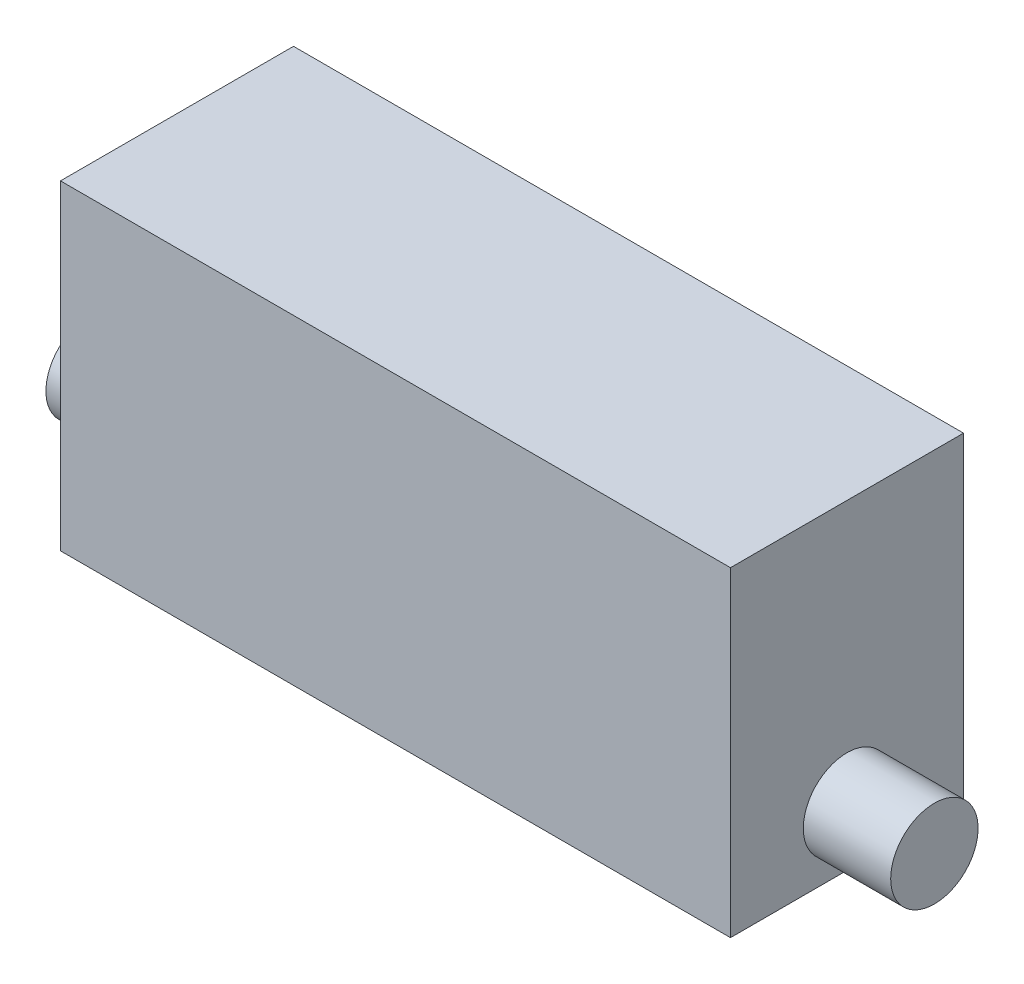
ISO-10303-21;
HEADER;
FILE_DESCRIPTION(('STEP AP214'),'2;1');
FILE_NAME('part.step','',(''),(''),'','','');
FILE_SCHEMA(('AUTOMOTIVE_DESIGN { 1 0 10303 214 1 1 1 1 }'));
ENDSEC;
DATA;
#1=APPLICATION_CONTEXT('core data for automotive mechanical design processes');
#2=APPLICATION_PROTOCOL_DEFINITION('international standard','automotive_design',2000,#1);
#3=PRODUCT_CONTEXT('',#1,'mechanical');
#4=PRODUCT('Part','Part','',(#3));
#5=PRODUCT_RELATED_PRODUCT_CATEGORY('part','',(#4));
#6=PRODUCT_DEFINITION_FORMATION('','',#4);
#7=PRODUCT_DEFINITION_CONTEXT('part definition',#1,'design');
#8=PRODUCT_DEFINITION('design','',#6,#7);
#9=PRODUCT_DEFINITION_SHAPE('','',#8);
#10=(LENGTH_UNIT() NAMED_UNIT(*) SI_UNIT(.MILLI.,.METRE.));
#11=(NAMED_UNIT(*) PLANE_ANGLE_UNIT() SI_UNIT($,.RADIAN.));
#12=(NAMED_UNIT(*) SI_UNIT($,.STERADIAN.) SOLID_ANGLE_UNIT());
#13=UNCERTAINTY_MEASURE_WITH_UNIT(LENGTH_MEASURE(1.E-05),#10,'distance_accuracy_value','');
#14=(GEOMETRIC_REPRESENTATION_CONTEXT(3) GLOBAL_UNCERTAINTY_ASSIGNED_CONTEXT((#13)) GLOBAL_UNIT_ASSIGNED_CONTEXT((#10,
#11,#12)) REPRESENTATION_CONTEXT('',''));
#15=CARTESIAN_POINT('',(0.,0.,0.));
#16=DIRECTION('',(0.,0.,1.));
#17=DIRECTION('',(1.,0.,0.));
#18=AXIS2_PLACEMENT_3D('',#15,#16,#17);
#19=CARTESIAN_POINT('',(0.,69.85,0.));
#20=DIRECTION('',(1.,0.,0.));
#21=DIRECTION('',(0.,0.,-1.));
#22=AXIS2_PLACEMENT_3D('',#19,#20,#21);
#23=PLANE('',#22);
#24=CARTESIAN_POINT('',(0.,12.7,-25.4));
#25=DIRECTION('',(1.,0.,0.));
#26=DIRECTION('',(0.,0.,-1.));
#27=AXIS2_PLACEMENT_3D('',#24,#25,#26);
#28=CIRCLE('',#27,9.525);
#29=CARTESIAN_POINT('',(0.,12.7,-34.925));
#30=VERTEX_POINT('',#29);
#31=EDGE_CURVE('E11',#30,#30,#28,.F.);
#32=ORIENTED_EDGE('',*,*,#31,.F.);
#33=EDGE_LOOP('',(#32));
#34=FACE_BOUND('',#33,.T.);
#35=DIRECTION('',(0.,0.,1.));
#36=VECTOR('',#35,1.);
#37=CARTESIAN_POINT('',(0.,0.,0.));
#38=LINE('',#37,#36);
#39=CARTESIAN_POINT('',(0.,0.,-50.8));
#40=VERTEX_POINT('',#39);
#41=CARTESIAN_POINT('',(0.,0.,0.));
#42=VERTEX_POINT('',#41);
#43=EDGE_CURVE('E100',#40,#42,#38,.T.);
#44=ORIENTED_EDGE('',*,*,#43,.T.);
#45=DIRECTION('',(0.,-1.,0.));
#46=VECTOR('',#45,1.);
#47=CARTESIAN_POINT('',(0.,69.85,0.));
#48=LINE('',#47,#46);
#49=CARTESIAN_POINT('',(0.,69.85,0.));
#50=VERTEX_POINT('',#49);
#51=EDGE_CURVE('E91',#50,#42,#48,.T.);
#52=ORIENTED_EDGE('',*,*,#51,.F.);
#53=DIRECTION('',(0.,0.,1.));
#54=VECTOR('',#53,1.);
#55=CARTESIAN_POINT('',(0.,69.85,0.));
#56=LINE('',#55,#54);
#57=CARTESIAN_POINT('',(0.,69.85,-50.8));
#58=VERTEX_POINT('',#57);
#59=EDGE_CURVE('E85',#58,#50,#56,.T.);
#60=ORIENTED_EDGE('',*,*,#59,.F.);
#61=DIRECTION('',(0.,-1.,0.));
#62=VECTOR('',#61,1.);
#63=CARTESIAN_POINT('',(0.,69.85,-50.8));
#64=LINE('',#63,#62);
#65=EDGE_CURVE('E96',#58,#40,#64,.T.);
#66=ORIENTED_EDGE('',*,*,#65,.T.);
#67=EDGE_LOOP('',(#44,#52,#60,#66));
#68=FACE_BOUND('',#67,.T.);
#69=ADVANCED_FACE('F33',(#34,#68),#23,.F.);
#70=CARTESIAN_POINT('',(0.,69.85,0.));
#71=DIRECTION('',(0.,0.,-1.));
#72=DIRECTION('',(-1.,0.,0.));
#73=AXIS2_PLACEMENT_3D('',#70,#71,#72);
#74=PLANE('',#73);
#75=DIRECTION('',(1.,0.,0.));
#76=VECTOR('',#75,1.);
#77=CARTESIAN_POINT('',(0.,0.,0.));
#78=LINE('',#77,#76);
#79=CARTESIAN_POINT('',(146.05,0.,0.));
#80=VERTEX_POINT('',#79);
#81=EDGE_CURVE('E90',#42,#80,#78,.T.);
#82=ORIENTED_EDGE('',*,*,#81,.T.);
#83=DIRECTION('',(0.,-1.,0.));
#84=VECTOR('',#83,1.);
#85=CARTESIAN_POINT('',(146.05,69.85,0.));
#86=LINE('',#85,#84);
#87=CARTESIAN_POINT('',(146.05,69.85,0.));
#88=VERTEX_POINT('',#87);
#89=EDGE_CURVE('E88',#88,#80,#86,.T.);
#90=ORIENTED_EDGE('',*,*,#89,.F.);
#91=DIRECTION('',(1.,0.,0.));
#92=VECTOR('',#91,1.);
#93=CARTESIAN_POINT('',(0.,69.85,0.));
#94=LINE('',#93,#92);
#95=EDGE_CURVE('E80',#50,#88,#94,.T.);
#96=ORIENTED_EDGE('',*,*,#95,.F.);
#97=ORIENTED_EDGE('',*,*,#51,.T.);
#98=EDGE_LOOP('',(#82,#90,#96,#97));
#99=FACE_BOUND('',#98,.T.);
#100=ADVANCED_FACE('F89',(#99),#74,.F.);
#101=CARTESIAN_POINT('',(146.05,69.85,0.));
#102=DIRECTION('',(-1.,0.,0.));
#103=DIRECTION('',(0.,0.,1.));
#104=AXIS2_PLACEMENT_3D('',#101,#102,#103);
#105=PLANE('',#104);
#106=CARTESIAN_POINT('',(146.05,12.7,-25.4));
#107=DIRECTION('',(-1.,0.,0.));
#108=DIRECTION('',(0.,0.,1.));
#109=AXIS2_PLACEMENT_3D('',#106,#107,#108);
#110=CIRCLE('',#109,9.525);
#111=CARTESIAN_POINT('',(146.05,12.7,-15.875));
#112=VERTEX_POINT('',#111);
#113=EDGE_CURVE('E41',#112,#112,#110,.F.);
#114=ORIENTED_EDGE('',*,*,#113,.F.);
#115=EDGE_LOOP('',(#114));
#116=FACE_BOUND('',#115,.T.);
#117=DIRECTION('',(0.,0.,-1.));
#118=VECTOR('',#117,1.);
#119=CARTESIAN_POINT('',(146.05,0.,0.));
#120=LINE('',#119,#118);
#121=CARTESIAN_POINT('',(146.05,0.,-50.8));
#122=VERTEX_POINT('',#121);
#123=EDGE_CURVE('E66',#80,#122,#120,.T.);
#124=ORIENTED_EDGE('',*,*,#123,.T.);
#125=DIRECTION('',(0.,-1.,0.));
#126=VECTOR('',#125,1.);
#127=CARTESIAN_POINT('',(146.05,69.85,-50.8));
#128=LINE('',#127,#126);
#129=CARTESIAN_POINT('',(146.05,69.85,-50.8));
#130=VERTEX_POINT('',#129);
#131=EDGE_CURVE('E92',#130,#122,#128,.T.);
#132=ORIENTED_EDGE('',*,*,#131,.F.);
#133=DIRECTION('',(0.,0.,-1.));
#134=VECTOR('',#133,1.);
#135=CARTESIAN_POINT('',(146.05,69.85,0.));
#136=LINE('',#135,#134);
#137=EDGE_CURVE('E83',#88,#130,#136,.T.);
#138=ORIENTED_EDGE('',*,*,#137,.F.);
#139=ORIENTED_EDGE('',*,*,#89,.T.);
#140=EDGE_LOOP('',(#124,#132,#138,#139));
#141=FACE_BOUND('',#140,.T.);
#142=ADVANCED_FACE('F94',(#116,#141),#105,.F.);
#143=CARTESIAN_POINT('',(0.,69.85,-50.8));
#144=DIRECTION('',(0.,0.,1.));
#145=DIRECTION('',(1.,0.,0.));
#146=AXIS2_PLACEMENT_3D('',#143,#144,#145);
#147=PLANE('',#146);
#148=DIRECTION('',(-1.,0.,0.));
#149=VECTOR('',#148,1.);
#150=CARTESIAN_POINT('',(0.,0.,-50.8));
#151=LINE('',#150,#149);
#152=EDGE_CURVE('E72',#122,#40,#151,.T.);
#153=ORIENTED_EDGE('',*,*,#152,.T.);
#154=ORIENTED_EDGE('',*,*,#65,.F.);
#155=DIRECTION('',(-1.,0.,0.));
#156=VECTOR('',#155,1.);
#157=CARTESIAN_POINT('',(0.,69.85,-50.8));
#158=LINE('',#157,#156);
#159=EDGE_CURVE('E49',#130,#58,#158,.T.);
#160=ORIENTED_EDGE('',*,*,#159,.F.);
#161=ORIENTED_EDGE('',*,*,#131,.T.);
#162=EDGE_LOOP('',(#153,#154,#160,#161));
#163=FACE_BOUND('',#162,.T.);
#164=ADVANCED_FACE('F115',(#163),#147,.F.);
#165=CARTESIAN_POINT('',(0.,69.85,0.));
#166=DIRECTION('',(0.,-1.,0.));
#167=DIRECTION('',(0.,0.,-1.));
#168=AXIS2_PLACEMENT_3D('',#165,#166,#167);
#169=PLANE('',#168);
#170=ORIENTED_EDGE('',*,*,#59,.T.);
#171=ORIENTED_EDGE('',*,*,#95,.T.);
#172=ORIENTED_EDGE('',*,*,#137,.T.);
#173=ORIENTED_EDGE('',*,*,#159,.T.);
#174=EDGE_LOOP('',(#170,#171,#172,#173));
#175=FACE_BOUND('',#174,.T.);
#176=ADVANCED_FACE('F81',(#175),#169,.F.);
#177=CARTESIAN_POINT('',(0.,0.,0.));
#178=DIRECTION('',(0.,-1.,0.));
#179=DIRECTION('',(0.,0.,-1.));
#180=AXIS2_PLACEMENT_3D('',#177,#178,#179);
#181=PLANE('',#180);
#182=ORIENTED_EDGE('',*,*,#43,.F.);
#183=ORIENTED_EDGE('',*,*,#152,.F.);
#184=ORIENTED_EDGE('',*,*,#123,.F.);
#185=ORIENTED_EDGE('',*,*,#81,.F.);
#186=EDGE_LOOP('',(#182,#183,#184,#185));
#187=FACE_BOUND('',#186,.T.);
#188=ADVANCED_FACE('F130',(#187),#181,.T.);
#189=CARTESIAN_POINT('',(165.1,12.7,-25.4));
#190=DIRECTION('',(-1.,0.,0.));
#191=DIRECTION('',(0.,0.,1.));
#192=AXIS2_PLACEMENT_3D('',#189,#190,#191);
#193=CYLINDRICAL_SURFACE('',#192,9.525);
#194=CARTESIAN_POINT('',(165.1,12.7,-25.4));
#195=DIRECTION('',(1.,0.,0.));
#196=DIRECTION('',(0.,0.,-1.));
#197=AXIS2_PLACEMENT_3D('',#194,#195,#196);
#198=CIRCLE('',#197,9.525);
#199=CARTESIAN_POINT('',(165.1,12.7,-15.875));
#200=VERTEX_POINT('',#199);
#201=EDGE_CURVE('E103',#200,#200,#198,.T.);
#202=CARTESIAN_POINT('',(165.1,12.7,-15.875));
#203=CARTESIAN_POINT('',(164.9015625,12.7,-15.875));
#204=CARTESIAN_POINT('',(164.703125,12.7,-15.875));
#205=CARTESIAN_POINT('',(164.30625,12.7,-15.875));
#206=CARTESIAN_POINT('',(164.1078125,12.7,-15.875));
#207=CARTESIAN_POINT('',(163.7109375,12.7,-15.875));
#208=CARTESIAN_POINT('',(163.5125,12.7,-15.875));
#209=CARTESIAN_POINT('',(163.115625,12.7,-15.875));
#210=CARTESIAN_POINT('',(162.9171875,12.7,-15.875));
#211=CARTESIAN_POINT('',(162.5203125,12.7,-15.875));
#212=CARTESIAN_POINT('',(162.321875,12.7,-15.875));
#213=CARTESIAN_POINT('',(161.925,12.7,-15.875));
#214=CARTESIAN_POINT('',(161.7265625,12.7,-15.875));
#215=CARTESIAN_POINT('',(161.3296875,12.7,-15.875));
#216=CARTESIAN_POINT('',(161.13125,12.7,-15.875));
#217=CARTESIAN_POINT('',(160.734375,12.7,-15.875));
#218=CARTESIAN_POINT('',(160.5359375,12.7,-15.875));
#219=CARTESIAN_POINT('',(160.1390625,12.7,-15.875));
#220=CARTESIAN_POINT('',(159.940625,12.7,-15.875));
#221=CARTESIAN_POINT('',(159.54375,12.7,-15.875));
#222=CARTESIAN_POINT('',(159.3453125,12.7,-15.875));
#223=CARTESIAN_POINT('',(158.9484375,12.7,-15.875));
#224=CARTESIAN_POINT('',(158.75,12.7,-15.875));
#225=CARTESIAN_POINT('',(158.353125,12.7,-15.875));
#226=CARTESIAN_POINT('',(158.1546875,12.7,-15.875));
#227=CARTESIAN_POINT('',(157.7578125,12.7,-15.875));
#228=CARTESIAN_POINT('',(157.559375,12.7,-15.875));
#229=CARTESIAN_POINT('',(157.1625,12.7,-15.875));
#230=CARTESIAN_POINT('',(156.9640625,12.7,-15.875));
#231=CARTESIAN_POINT('',(156.5671875,12.7,-15.875));
#232=CARTESIAN_POINT('',(156.36875,12.7,-15.875));
#233=CARTESIAN_POINT('',(155.971875,12.7,-15.875));
#234=CARTESIAN_POINT('',(155.7734375,12.7,-15.875));
#235=CARTESIAN_POINT('',(155.3765625,12.7,-15.875));
#236=CARTESIAN_POINT('',(155.178125,12.7,-15.875));
#237=CARTESIAN_POINT('',(154.78125,12.7,-15.875));
#238=CARTESIAN_POINT('',(154.5828125,12.7,-15.875));
#239=CARTESIAN_POINT('',(154.1859375,12.7,-15.875));
#240=CARTESIAN_POINT('',(153.9875,12.7,-15.875));
#241=CARTESIAN_POINT('',(153.590625,12.7,-15.875));
#242=CARTESIAN_POINT('',(153.3921875,12.7,-15.875));
#243=CARTESIAN_POINT('',(152.9953125,12.7,-15.875));
#244=CARTESIAN_POINT('',(152.796875,12.7,-15.875));
#245=CARTESIAN_POINT('',(152.4,12.7,-15.875));
#246=CARTESIAN_POINT('',(152.2015625,12.7,-15.875));
#247=CARTESIAN_POINT('',(151.8046875,12.7,-15.875));
#248=CARTESIAN_POINT('',(151.60625,12.7,-15.875));
#249=CARTESIAN_POINT('',(151.209375,12.7,-15.875));
#250=CARTESIAN_POINT('',(151.0109375,12.7,-15.875));
#251=CARTESIAN_POINT('',(150.6140625,12.7,-15.875));
#252=CARTESIAN_POINT('',(150.415625,12.7,-15.875));
#253=CARTESIAN_POINT('',(150.01875,12.7,-15.875));
#254=CARTESIAN_POINT('',(149.8203125,12.7,-15.875));
#255=CARTESIAN_POINT('',(149.4234375,12.7,-15.875));
#256=CARTESIAN_POINT('',(149.225,12.7,-15.875));
#257=CARTESIAN_POINT('',(148.828125,12.7,-15.875));
#258=CARTESIAN_POINT('',(148.6296875,12.7,-15.875));
#259=CARTESIAN_POINT('',(148.2328125,12.7,-15.875));
#260=CARTESIAN_POINT('',(148.034375,12.7,-15.875));
#261=CARTESIAN_POINT('',(147.6375,12.7,-15.875));
#262=CARTESIAN_POINT('',(147.4390625,12.7,-15.875));
#263=CARTESIAN_POINT('',(147.0421875,12.7,-15.875));
#264=CARTESIAN_POINT('',(146.84375,12.7,-15.875));
#265=CARTESIAN_POINT('',(146.446875,12.7,-15.875));
#266=CARTESIAN_POINT('',(146.2484375,12.7,-15.875));
#267=CARTESIAN_POINT('',(146.05,12.7,-15.875));
#268=B_SPLINE_CURVE_WITH_KNOTS('',3,(#202,#203,#204,#205,#206,#207,#208,#209,#210,#211,#212,
#213,#214,#215,#216,#217,#218,#219,#220,#221,#222,#223,#224,#225,#226,#227,#228,#229,#230,#231,
#232,#233,#234,#235,#236,#237,#238,#239,#240,#241,#242,#243,#244,#245,#246,#247,#248,#249,#250,
#251,#252,#253,#254,#255,#256,#257,#258,#259,#260,#261,#262,#263,#264,#265,#266,#267),
.UNSPECIFIED.,.F.,.F.,(4,2,2,2,2,2,2,2,2,2,2,2,2,2,2,2,2,2,2,2,2,2,2,2,2,2,2,2,2,2,2,2,4),(0.,
0.5953125,1.190625,1.7859375,2.38125,2.9765625,3.571875,4.1671875,4.7625,5.3578125,5.953125,
6.5484375,7.14375,7.7390625,8.334375,8.92968750000001,9.52500000000001,10.1203125,10.715625,
11.3109375,11.90625,12.5015625,13.096875,13.6921875,14.2875,14.8828125,15.478125,16.0734375,
16.66875,17.2640625,17.859375,18.4546875,19.05),.UNSPECIFIED.);
#269=EDGE_CURVE('BSEAM112',#200,#112,#268,.T.);
#270=ORIENTED_EDGE('',*,*,#201,.F.);
#271=ORIENTED_EDGE('',*,*,#113,.T.);
#272=ORIENTED_EDGE('',*,*,#269,.T.);
#273=ORIENTED_EDGE('',*,*,#269,.F.);
#274=EDGE_LOOP('',(#270,#272,#271,#273));
#275=FACE_BOUND('',#274,.T.);
#276=ADVANCED_FACE('F112',(#275),#193,.T.);
#277=CARTESIAN_POINT('',(165.1,12.7,-25.4));
#278=DIRECTION('',(1.,0.,0.));
#279=DIRECTION('',(0.,0.,-1.));
#280=AXIS2_PLACEMENT_3D('',#277,#278,#279);
#281=PLANE('',#280);
#282=ORIENTED_EDGE('',*,*,#201,.T.);
#283=EDGE_LOOP('',(#282));
#284=FACE_BOUND('',#283,.T.);
#285=ADVANCED_FACE('F137',(#284),#281,.T.);
#286=CARTESIAN_POINT('',(-19.05,12.7,-25.4));
#287=DIRECTION('',(1.,0.,0.));
#288=DIRECTION('',(0.,0.,-1.));
#289=AXIS2_PLACEMENT_3D('',#286,#287,#288);
#290=CYLINDRICAL_SURFACE('',#289,9.525);
#291=CARTESIAN_POINT('',(-19.05,12.7,-25.4));
#292=DIRECTION('',(-1.,0.,0.));
#293=DIRECTION('',(0.,0.,1.));
#294=AXIS2_PLACEMENT_3D('',#291,#292,#293);
#295=CIRCLE('',#294,9.525);
#296=CARTESIAN_POINT('',(-19.05,12.7,-34.925));
#297=VERTEX_POINT('',#296);
#298=EDGE_CURVE('E156',#297,#297,#295,.T.);
#299=CARTESIAN_POINT('',(-19.05,12.7,-34.925));
#300=CARTESIAN_POINT('',(-18.8515625,12.7,-34.925));
#301=CARTESIAN_POINT('',(-18.653125,12.7,-34.925));
#302=CARTESIAN_POINT('',(-18.25625,12.7,-34.925));
#303=CARTESIAN_POINT('',(-18.0578125,12.7,-34.925));
#304=CARTESIAN_POINT('',(-17.6609375,12.7,-34.925));
#305=CARTESIAN_POINT('',(-17.4625,12.7,-34.925));
#306=CARTESIAN_POINT('',(-17.065625,12.7,-34.925));
#307=CARTESIAN_POINT('',(-16.8671875,12.7,-34.925));
#308=CARTESIAN_POINT('',(-16.4703125,12.7,-34.925));
#309=CARTESIAN_POINT('',(-16.271875,12.7,-34.925));
#310=CARTESIAN_POINT('',(-15.875,12.7,-34.925));
#311=CARTESIAN_POINT('',(-15.6765625,12.7,-34.925));
#312=CARTESIAN_POINT('',(-15.2796875,12.7,-34.925));
#313=CARTESIAN_POINT('',(-15.08125,12.7,-34.925));
#314=CARTESIAN_POINT('',(-14.684375,12.7,-34.925));
#315=CARTESIAN_POINT('',(-14.4859375,12.7,-34.925));
#316=CARTESIAN_POINT('',(-14.0890625,12.7,-34.925));
#317=CARTESIAN_POINT('',(-13.890625,12.7,-34.925));
#318=CARTESIAN_POINT('',(-13.49375,12.7,-34.925));
#319=CARTESIAN_POINT('',(-13.2953125,12.7,-34.925));
#320=CARTESIAN_POINT('',(-12.8984375,12.7,-34.925));
#321=CARTESIAN_POINT('',(-12.7,12.7,-34.925));
#322=CARTESIAN_POINT('',(-12.303125,12.7,-34.925));
#323=CARTESIAN_POINT('',(-12.1046875,12.7,-34.925));
#324=CARTESIAN_POINT('',(-11.7078125,12.7,-34.925));
#325=CARTESIAN_POINT('',(-11.509375,12.7,-34.925));
#326=CARTESIAN_POINT('',(-11.1125,12.7,-34.925));
#327=CARTESIAN_POINT('',(-10.9140625,12.7,-34.925));
#328=CARTESIAN_POINT('',(-10.5171875,12.7,-34.925));
#329=CARTESIAN_POINT('',(-10.31875,12.7,-34.925));
#330=CARTESIAN_POINT('',(-9.921875,12.7,-34.925));
#331=CARTESIAN_POINT('',(-9.7234375,12.7,-34.925));
#332=CARTESIAN_POINT('',(-9.3265625,12.7,-34.925));
#333=CARTESIAN_POINT('',(-9.128125,12.7,-34.925));
#334=CARTESIAN_POINT('',(-8.73125,12.7,-34.925));
#335=CARTESIAN_POINT('',(-8.5328125,12.7,-34.925));
#336=CARTESIAN_POINT('',(-8.1359375,12.7,-34.925));
#337=CARTESIAN_POINT('',(-7.9375,12.7,-34.925));
#338=CARTESIAN_POINT('',(-7.540625,12.7,-34.925));
#339=CARTESIAN_POINT('',(-7.3421875,12.7,-34.925));
#340=CARTESIAN_POINT('',(-6.9453125,12.7,-34.925));
#341=CARTESIAN_POINT('',(-6.746875,12.7,-34.925));
#342=CARTESIAN_POINT('',(-6.35,12.7,-34.925));
#343=CARTESIAN_POINT('',(-6.1515625,12.7,-34.925));
#344=CARTESIAN_POINT('',(-5.7546875,12.7,-34.925));
#345=CARTESIAN_POINT('',(-5.55625,12.7,-34.925));
#346=CARTESIAN_POINT('',(-5.159375,12.7,-34.925));
#347=CARTESIAN_POINT('',(-4.9609375,12.7,-34.925));
#348=CARTESIAN_POINT('',(-4.5640625,12.7,-34.925));
#349=CARTESIAN_POINT('',(-4.365625,12.7,-34.925));
#350=CARTESIAN_POINT('',(-3.96875,12.7,-34.925));
#351=CARTESIAN_POINT('',(-3.7703125,12.7,-34.925));
#352=CARTESIAN_POINT('',(-3.3734375,12.7,-34.925));
#353=CARTESIAN_POINT('',(-3.175,12.7,-34.925));
#354=CARTESIAN_POINT('',(-2.778125,12.7,-34.925));
#355=CARTESIAN_POINT('',(-2.5796875,12.7,-34.925));
#356=CARTESIAN_POINT('',(-2.1828125,12.7,-34.925));
#357=CARTESIAN_POINT('',(-1.984375,12.7,-34.925));
#358=CARTESIAN_POINT('',(-1.5875,12.7,-34.925));
#359=CARTESIAN_POINT('',(-1.3890625,12.7,-34.925));
#360=CARTESIAN_POINT('',(-0.992187500000001,12.7,-34.925));
#361=CARTESIAN_POINT('',(-0.793750000000001,12.7,-34.925));
#362=CARTESIAN_POINT('',(-0.396875,12.7,-34.925));
#363=CARTESIAN_POINT('',(-0.1984375,12.7,-34.925));
#364=CARTESIAN_POINT('',(0.,12.7,-34.925));
#365=B_SPLINE_CURVE_WITH_KNOTS('',3,(#299,#300,#301,#302,#303,#304,#305,#306,#307,#308,#309,
#310,#311,#312,#313,#314,#315,#316,#317,#318,#319,#320,#321,#322,#323,#324,#325,#326,#327,#328,
#329,#330,#331,#332,#333,#334,#335,#336,#337,#338,#339,#340,#341,#342,#343,#344,#345,#346,#347,
#348,#349,#350,#351,#352,#353,#354,#355,#356,#357,#358,#359,#360,#361,#362,#363,#364),
.UNSPECIFIED.,.F.,.F.,(4,2,2,2,2,2,2,2,2,2,2,2,2,2,2,2,2,2,2,2,2,2,2,2,2,2,2,2,2,2,2,2,4),(0.,
0.5953125,1.190625,1.7859375,2.38125,2.9765625,3.571875,4.1671875,4.7625,5.3578125,5.953125,
6.5484375,7.14375,7.7390625,8.334375,8.9296875,9.525,10.1203125,10.715625,11.3109375,11.90625,
12.5015625,13.096875,13.6921875,14.2875,14.8828125,15.478125,16.0734375,16.66875,17.2640625,
17.859375,18.4546875,19.05),.UNSPECIFIED.);
#366=EDGE_CURVE('BSEAM144',#297,#30,#365,.T.);
#367=ORIENTED_EDGE('',*,*,#298,.F.);
#368=ORIENTED_EDGE('',*,*,#31,.T.);
#369=ORIENTED_EDGE('',*,*,#366,.T.);
#370=ORIENTED_EDGE('',*,*,#366,.F.);
#371=EDGE_LOOP('',(#367,#369,#368,#370));
#372=FACE_BOUND('',#371,.T.);
#373=ADVANCED_FACE('F144',(#372),#290,.T.);
#374=CARTESIAN_POINT('',(-19.05,12.7,-25.4));
#375=DIRECTION('',(-1.,0.,0.));
#376=DIRECTION('',(0.,0.,1.));
#377=AXIS2_PLACEMENT_3D('',#374,#375,#376);
#378=PLANE('',#377);
#379=ORIENTED_EDGE('',*,*,#298,.T.);
#380=EDGE_LOOP('',(#379));
#381=FACE_BOUND('',#380,.T.);
#382=ADVANCED_FACE('F148',(#381),#378,.T.);
#383=CLOSED_SHELL('',(#69,#100,#142,#164,#176,#188,#276,#285,#373,#382));
#384=MANIFOLD_SOLID_BREP('B2',#383);
#385=ADVANCED_BREP_SHAPE_REPRESENTATION('',(#18,#384),#14);
#386=SHAPE_DEFINITION_REPRESENTATION(#9,#385);
ENDSEC;
END-ISO-10303-21;
